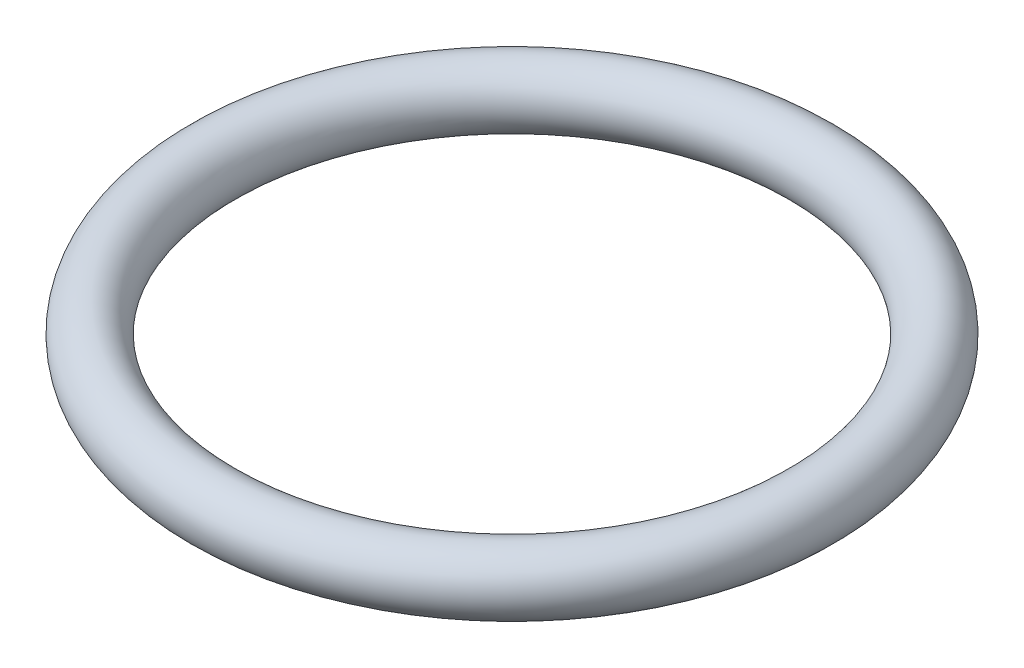
ISO-10303-21;
HEADER;
FILE_DESCRIPTION(('STEP AP214'),'2;1');
FILE_NAME('part.step','',(''),(''),'','','');
FILE_SCHEMA(('AUTOMOTIVE_DESIGN { 1 0 10303 214 1 1 1 1 }'));
ENDSEC;
DATA;
#1=APPLICATION_CONTEXT('core data for automotive mechanical design processes');
#2=APPLICATION_PROTOCOL_DEFINITION('international standard','automotive_design',2000,#1);
#3=PRODUCT_CONTEXT('',#1,'mechanical');
#4=PRODUCT('Part','Part','',(#3));
#5=PRODUCT_RELATED_PRODUCT_CATEGORY('part','',(#4));
#6=PRODUCT_DEFINITION_FORMATION('','',#4);
#7=PRODUCT_DEFINITION_CONTEXT('part definition',#1,'design');
#8=PRODUCT_DEFINITION('design','',#6,#7);
#9=PRODUCT_DEFINITION_SHAPE('','',#8);
#10=(LENGTH_UNIT() NAMED_UNIT(*) SI_UNIT(.MILLI.,.METRE.));
#11=(NAMED_UNIT(*) PLANE_ANGLE_UNIT() SI_UNIT($,.RADIAN.));
#12=(NAMED_UNIT(*) SI_UNIT($,.STERADIAN.) SOLID_ANGLE_UNIT());
#13=UNCERTAINTY_MEASURE_WITH_UNIT(LENGTH_MEASURE(1.E-05),#10,'distance_accuracy_value','');
#14=(GEOMETRIC_REPRESENTATION_CONTEXT(3) GLOBAL_UNCERTAINTY_ASSIGNED_CONTEXT((#13)) GLOBAL_UNIT_ASSIGNED_CONTEXT((#10,
#11,#12)) REPRESENTATION_CONTEXT('',''));
#15=CARTESIAN_POINT('',(0.,0.,0.));
#16=DIRECTION('',(0.,0.,1.));
#17=DIRECTION('',(1.,0.,0.));
#18=AXIS2_PLACEMENT_3D('',#15,#16,#17);
#19=CARTESIAN_POINT('',(8.61,0.,0.));
#20=DIRECTION('',(0.,-1.,0.));
#21=DIRECTION('',(0.,0.,-1.));
#22=AXIS2_PLACEMENT_3D('',#19,#20,#21);
#23=TOROIDAL_SURFACE('',#22,8.61,0.89);
#24=CARTESIAN_POINT('',(8.61,0.,-9.5));
#25=VERTEX_POINT('',#24);
#26=VERTEX_LOOP('',#25);
#27=FACE_BOUND('',#26,.T.);
#28=ADVANCED_FACE('F29',(#27),#23,.T.);
#29=CLOSED_SHELL('',(#28));
#30=MANIFOLD_SOLID_BREP('B2',#29);
#31=ADVANCED_BREP_SHAPE_REPRESENTATION('',(#18,#30),#14);
#32=SHAPE_DEFINITION_REPRESENTATION(#9,#31);
ENDSEC;
END-ISO-10303-21;
